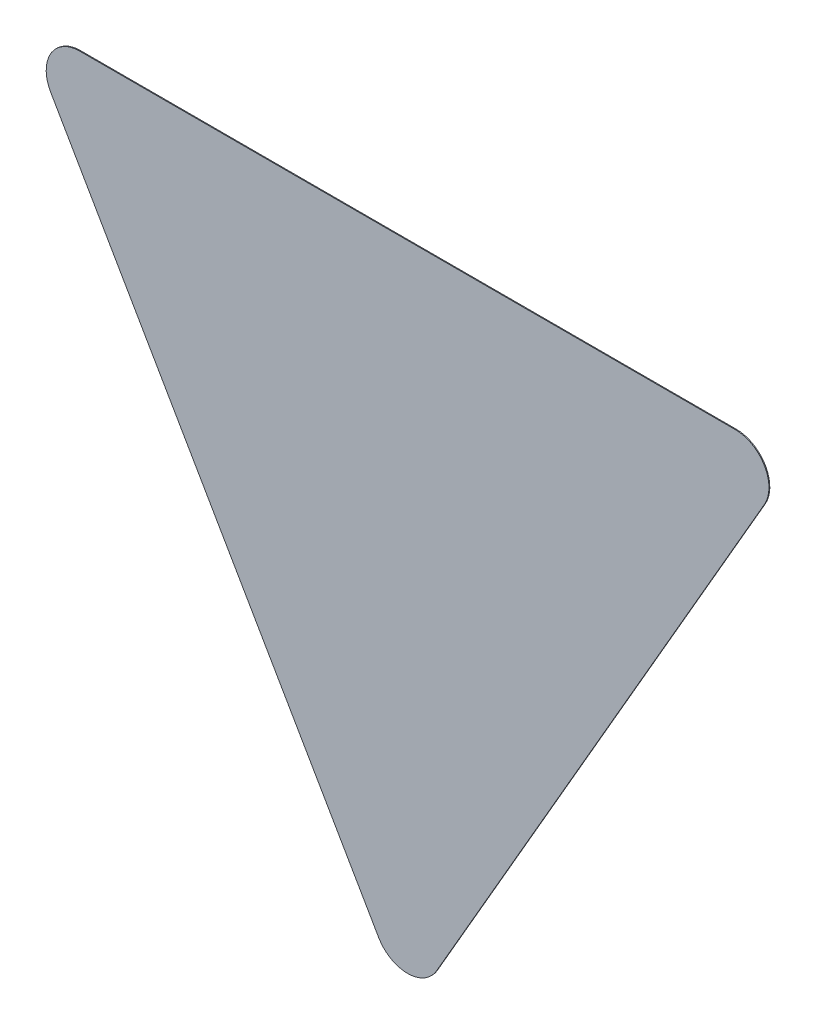
ISO-10303-21;
HEADER;
FILE_DESCRIPTION(('STEP AP214'),'2;1');
FILE_NAME('part.step','',(''),(''),'','','');
FILE_SCHEMA(('AUTOMOTIVE_DESIGN { 1 0 10303 214 1 1 1 1 }'));
ENDSEC;
DATA;
#1=APPLICATION_CONTEXT('core data for automotive mechanical design processes');
#2=APPLICATION_PROTOCOL_DEFINITION('international standard','automotive_design',2000,#1);
#3=PRODUCT_CONTEXT('',#1,'mechanical');
#4=PRODUCT('Part','Part','',(#3));
#5=PRODUCT_RELATED_PRODUCT_CATEGORY('part','',(#4));
#6=PRODUCT_DEFINITION_FORMATION('','',#4);
#7=PRODUCT_DEFINITION_CONTEXT('part definition',#1,'design');
#8=PRODUCT_DEFINITION('design','',#6,#7);
#9=PRODUCT_DEFINITION_SHAPE('','',#8);
#10=(LENGTH_UNIT() NAMED_UNIT(*) SI_UNIT(.MILLI.,.METRE.));
#11=(NAMED_UNIT(*) PLANE_ANGLE_UNIT() SI_UNIT($,.RADIAN.));
#12=(NAMED_UNIT(*) SI_UNIT($,.STERADIAN.) SOLID_ANGLE_UNIT());
#13=UNCERTAINTY_MEASURE_WITH_UNIT(LENGTH_MEASURE(1.E-05),#10,'distance_accuracy_value','');
#14=(GEOMETRIC_REPRESENTATION_CONTEXT(3) GLOBAL_UNCERTAINTY_ASSIGNED_CONTEXT((#13)) GLOBAL_UNIT_ASSIGNED_CONTEXT((#10,
#11,#12)) REPRESENTATION_CONTEXT('',''));
#15=CARTESIAN_POINT('',(0.,0.,0.));
#16=DIRECTION('',(0.,0.,1.));
#17=DIRECTION('',(1.,0.,0.));
#18=AXIS2_PLACEMENT_3D('',#15,#16,#17);
#19=CARTESIAN_POINT('',(0.,-19.9999982515612,0.065));
#20=DIRECTION('',(0.,0.,-1.));
#21=DIRECTION('',(-1.,0.,0.));
#22=AXIS2_PLACEMENT_3D('',#19,#20,#21);
#23=CYLINDRICAL_SURFACE('',#22,2.5);
#24=CARTESIAN_POINT('',(0.,-19.9999982515612,0.));
#25=DIRECTION('',(0.,0.,1.));
#26=DIRECTION('',(1.,0.,0.));
#27=AXIS2_PLACEMENT_3D('',#24,#25,#26);
#28=CIRCLE('',#27,2.5);
#29=CARTESIAN_POINT('',(-2.16506376182637,-21.2499978144516,0.));
#30=VERTEX_POINT('',#29);
#31=CARTESIAN_POINT('',(2.16506376182637,-21.2499978144516,0.));
#32=VERTEX_POINT('',#31);
#33=EDGE_CURVE('E116',#30,#32,#28,.T.);
#34=ORIENTED_EDGE('',*,*,#33,.T.);
#35=DIRECTION('',(0.,0.,-1.));
#36=VECTOR('',#35,1.);
#37=CARTESIAN_POINT('',(2.16506376182637,-21.2499978144516,0.065));
#38=LINE('',#37,#36);
#39=CARTESIAN_POINT('',(2.16506376182637,-21.2499978144516,0.065));
#40=VERTEX_POINT('',#39);
#41=EDGE_CURVE('E11',#40,#32,#38,.T.);
#42=ORIENTED_EDGE('',*,*,#41,.F.);
#43=CARTESIAN_POINT('',(0.,-19.9999982515612,0.065));
#44=DIRECTION('',(0.,0.,1.));
#45=DIRECTION('',(1.,0.,0.));
#46=AXIS2_PLACEMENT_3D('',#43,#44,#45);
#47=CIRCLE('',#46,2.5);
#48=CARTESIAN_POINT('',(-2.16506376182637,-21.2499978144516,0.065));
#49=VERTEX_POINT('',#48);
#50=EDGE_CURVE('E127',#49,#40,#47,.T.);
#51=ORIENTED_EDGE('',*,*,#50,.F.);
#52=DIRECTION('',(0.,0.,-1.));
#53=VECTOR('',#52,1.);
#54=CARTESIAN_POINT('',(-2.16506376182637,-21.2499978144516,0.065));
#55=LINE('',#54,#53);
#56=EDGE_CURVE('E112',#49,#30,#55,.T.);
#57=ORIENTED_EDGE('',*,*,#56,.T.);
#58=EDGE_LOOP('',(#34,#42,#51,#57));
#59=FACE_BOUND('',#58,.T.);
#60=ADVANCED_FACE('F33',(#59),#23,.T.);
#61=CARTESIAN_POINT('',(2.16506376182637,-21.2499978144516,0.065));
#62=DIRECTION('',(-0.866025504730543,0.499999825156179,0.));
#63=DIRECTION('',(-0.499999825156179,-0.866025504730543,0.));
#64=AXIS2_PLACEMENT_3D('',#61,#62,#63);
#65=PLANE('',#64);
#66=DIRECTION('',(0.499999825156179,0.866025504730543,0.));
#67=VECTOR('',#66,1.);
#68=CARTESIAN_POINT('',(2.16506376182637,-21.2499978144516,0.));
#69=LINE('',#68,#67);
#70=CARTESIAN_POINT('',(26.7024377523652,21.2500004371095,0.));
#71=VERTEX_POINT('',#70);
#72=EDGE_CURVE('E119',#32,#71,#69,.T.);
#73=ORIENTED_EDGE('',*,*,#72,.T.);
#74=DIRECTION('',(0.,0.,-1.));
#75=VECTOR('',#74,1.);
#76=CARTESIAN_POINT('',(26.7024377523652,21.2500004371095,0.065));
#77=LINE('',#76,#75);
#78=CARTESIAN_POINT('',(26.7024377523652,21.2500004371095,0.065));
#79=VERTEX_POINT('',#78);
#80=EDGE_CURVE('E41',#79,#71,#77,.T.);
#81=ORIENTED_EDGE('',*,*,#80,.F.);
#82=DIRECTION('',(0.499999825156179,0.866025504730543,0.));
#83=VECTOR('',#82,1.);
#84=CARTESIAN_POINT('',(2.16506376182637,-21.2499978144516,0.065));
#85=LINE('',#84,#83);
#86=EDGE_CURVE('E86',#40,#79,#85,.T.);
#87=ORIENTED_EDGE('',*,*,#86,.F.);
#88=ORIENTED_EDGE('',*,*,#41,.T.);
#89=EDGE_LOOP('',(#73,#81,#87,#88));
#90=FACE_BOUND('',#89,.T.);
#91=ADVANCED_FACE('F151',(#90),#65,.F.);
#92=CARTESIAN_POINT('',(24.5373739905388,22.5,0.065));
#93=DIRECTION('',(0.,0.,-1.));
#94=DIRECTION('',(-1.,0.,0.));
#95=AXIS2_PLACEMENT_3D('',#92,#93,#94);
#96=CYLINDRICAL_SURFACE('',#95,2.5);
#97=CARTESIAN_POINT('',(24.5373739905388,22.5,0.));
#98=DIRECTION('',(0.,0.,1.));
#99=DIRECTION('',(1.,0.,0.));
#100=AXIS2_PLACEMENT_3D('',#97,#98,#99);
#101=CIRCLE('',#100,2.5);
#102=CARTESIAN_POINT('',(24.5373739905388,25.,0.));
#103=VERTEX_POINT('',#102);
#104=EDGE_CURVE('E121',#71,#103,#101,.T.);
#105=ORIENTED_EDGE('',*,*,#104,.T.);
#106=DIRECTION('',(0.,0.,-1.));
#107=VECTOR('',#106,1.);
#108=CARTESIAN_POINT('',(24.5373739905388,25.,0.065));
#109=LINE('',#108,#107);
#110=CARTESIAN_POINT('',(24.5373739905388,25.,0.065));
#111=VERTEX_POINT('',#110);
#112=EDGE_CURVE('E107',#111,#103,#109,.T.);
#113=ORIENTED_EDGE('',*,*,#112,.F.);
#114=CARTESIAN_POINT('',(24.5373739905388,22.5,0.065));
#115=DIRECTION('',(0.,0.,1.));
#116=DIRECTION('',(1.,0.,0.));
#117=AXIS2_PLACEMENT_3D('',#114,#115,#116);
#118=CIRCLE('',#117,2.5);
#119=EDGE_CURVE('E99',#79,#111,#118,.T.);
#120=ORIENTED_EDGE('',*,*,#119,.F.);
#121=ORIENTED_EDGE('',*,*,#80,.T.);
#122=EDGE_LOOP('',(#105,#113,#120,#121));
#123=FACE_BOUND('',#122,.T.);
#124=ADVANCED_FACE('F133',(#123),#96,.T.);
#125=CARTESIAN_POINT('',(0.,25.,0.065));
#126=DIRECTION('',(0.,-1.,0.));
#127=DIRECTION('',(0.,0.,-1.));
#128=AXIS2_PLACEMENT_3D('',#125,#126,#127);
#129=PLANE('',#128);
#130=DIRECTION('',(-1.,0.,0.));
#131=VECTOR('',#130,1.);
#132=CARTESIAN_POINT('',(0.,25.,0.));
#133=LINE('',#132,#131);
#134=CARTESIAN_POINT('',(-24.5373739905388,25.,0.));
#135=VERTEX_POINT('',#134);
#136=EDGE_CURVE('E106',#103,#135,#133,.T.);
#137=ORIENTED_EDGE('',*,*,#136,.T.);
#138=DIRECTION('',(0.,0.,-1.));
#139=VECTOR('',#138,1.);
#140=CARTESIAN_POINT('',(-24.5373739905388,25.,0.065));
#141=LINE('',#140,#139);
#142=CARTESIAN_POINT('',(-24.5373739905388,25.,0.065));
#143=VERTEX_POINT('',#142);
#144=EDGE_CURVE('E104',#143,#135,#141,.T.);
#145=ORIENTED_EDGE('',*,*,#144,.F.);
#146=DIRECTION('',(-1.,0.,0.));
#147=VECTOR('',#146,1.);
#148=CARTESIAN_POINT('',(0.,25.,0.065));
#149=LINE('',#148,#147);
#150=EDGE_CURVE('E93',#111,#143,#149,.T.);
#151=ORIENTED_EDGE('',*,*,#150,.F.);
#152=ORIENTED_EDGE('',*,*,#112,.T.);
#153=EDGE_LOOP('',(#137,#145,#151,#152));
#154=FACE_BOUND('',#153,.T.);
#155=ADVANCED_FACE('F105',(#154),#129,.F.);
#156=CARTESIAN_POINT('',(-24.5373739905389,22.5,0.065));
#157=DIRECTION('',(0.,0.,-1.));
#158=DIRECTION('',(-1.,0.,0.));
#159=AXIS2_PLACEMENT_3D('',#156,#157,#158);
#160=CYLINDRICAL_SURFACE('',#159,2.5);
#161=CARTESIAN_POINT('',(-24.5373739905389,22.5,0.));
#162=DIRECTION('',(0.,0.,1.));
#163=DIRECTION('',(-1.,0.,0.));
#164=AXIS2_PLACEMENT_3D('',#161,#162,#163);
#165=CIRCLE('',#164,2.5);
#166=CARTESIAN_POINT('',(-26.7024377523652,21.2500004371095,0.));
#167=VERTEX_POINT('',#166);
#168=EDGE_CURVE('E72',#135,#167,#165,.T.);
#169=ORIENTED_EDGE('',*,*,#168,.T.);
#170=DIRECTION('',(0.,0.,-1.));
#171=VECTOR('',#170,1.);
#172=CARTESIAN_POINT('',(-26.7024377523652,21.2500004371095,0.065));
#173=LINE('',#172,#171);
#174=CARTESIAN_POINT('',(-26.7024377523652,21.2500004371095,0.065));
#175=VERTEX_POINT('',#174);
#176=EDGE_CURVE('E108',#175,#167,#173,.T.);
#177=ORIENTED_EDGE('',*,*,#176,.F.);
#178=CARTESIAN_POINT('',(-24.5373739905389,22.5,0.065));
#179=DIRECTION('',(0.,0.,1.));
#180=DIRECTION('',(-1.,0.,0.));
#181=AXIS2_PLACEMENT_3D('',#178,#179,#180);
#182=CIRCLE('',#181,2.5);
#183=EDGE_CURVE('E97',#143,#175,#182,.T.);
#184=ORIENTED_EDGE('',*,*,#183,.F.);
#185=ORIENTED_EDGE('',*,*,#144,.T.);
#186=EDGE_LOOP('',(#169,#177,#184,#185));
#187=FACE_BOUND('',#186,.T.);
#188=ADVANCED_FACE('F110',(#187),#160,.T.);
#189=CARTESIAN_POINT('',(-26.7024377523652,21.2500004371095,0.065));
#190=DIRECTION('',(0.866025504730543,0.499999825156179,0.));
#191=DIRECTION('',(-0.499999825156179,0.866025504730543,0.));
#192=AXIS2_PLACEMENT_3D('',#189,#190,#191);
#193=PLANE('',#192);
#194=DIRECTION('',(0.499999825156179,-0.866025504730543,0.));
#195=VECTOR('',#194,1.);
#196=CARTESIAN_POINT('',(-26.7024377523652,21.2500004371095,0.));
#197=LINE('',#196,#195);
#198=EDGE_CURVE('E78',#167,#30,#197,.T.);
#199=ORIENTED_EDGE('',*,*,#198,.T.);
#200=ORIENTED_EDGE('',*,*,#56,.F.);
#201=DIRECTION('',(0.499999825156179,-0.866025504730543,0.));
#202=VECTOR('',#201,1.);
#203=CARTESIAN_POINT('',(-26.7024377523652,21.2500004371095,0.065));
#204=LINE('',#203,#202);
#205=EDGE_CURVE('E49',#175,#49,#204,.T.);
#206=ORIENTED_EDGE('',*,*,#205,.F.);
#207=ORIENTED_EDGE('',*,*,#176,.T.);
#208=EDGE_LOOP('',(#199,#200,#206,#207));
#209=FACE_BOUND('',#208,.T.);
#210=ADVANCED_FACE('F140',(#209),#193,.F.);
#211=CARTESIAN_POINT('',(0.,-19.9999982515612,0.065));
#212=DIRECTION('',(0.,0.,1.));
#213=DIRECTION('',(1.,0.,0.));
#214=AXIS2_PLACEMENT_3D('',#211,#212,#213);
#215=PLANE('',#214);
#216=ORIENTED_EDGE('',*,*,#50,.T.);
#217=ORIENTED_EDGE('',*,*,#86,.T.);
#218=ORIENTED_EDGE('',*,*,#119,.T.);
#219=ORIENTED_EDGE('',*,*,#150,.T.);
#220=ORIENTED_EDGE('',*,*,#183,.T.);
#221=ORIENTED_EDGE('',*,*,#205,.T.);
#222=EDGE_LOOP('',(#216,#217,#218,#219,#220,#221));
#223=FACE_BOUND('',#222,.T.);
#224=ADVANCED_FACE('F95',(#223),#215,.T.);
#225=CARTESIAN_POINT('',(0.,-19.9999982515612,0.));
#226=DIRECTION('',(0.,0.,1.));
#227=DIRECTION('',(1.,0.,0.));
#228=AXIS2_PLACEMENT_3D('',#225,#226,#227);
#229=PLANE('',#228);
#230=ORIENTED_EDGE('',*,*,#33,.F.);
#231=ORIENTED_EDGE('',*,*,#198,.F.);
#232=ORIENTED_EDGE('',*,*,#168,.F.);
#233=ORIENTED_EDGE('',*,*,#136,.F.);
#234=ORIENTED_EDGE('',*,*,#104,.F.);
#235=ORIENTED_EDGE('',*,*,#72,.F.);
#236=EDGE_LOOP('',(#230,#231,#232,#233,#234,#235));
#237=FACE_BOUND('',#236,.T.);
#238=ADVANCED_FACE('F136',(#237),#229,.F.);
#239=CLOSED_SHELL('',(#60,#91,#124,#155,#188,#210,#224,#238));
#240=MANIFOLD_SOLID_BREP('B2',#239);
#241=ADVANCED_BREP_SHAPE_REPRESENTATION('',(#18,#240),#14);
#242=SHAPE_DEFINITION_REPRESENTATION(#9,#241);
ENDSEC;
END-ISO-10303-21;
